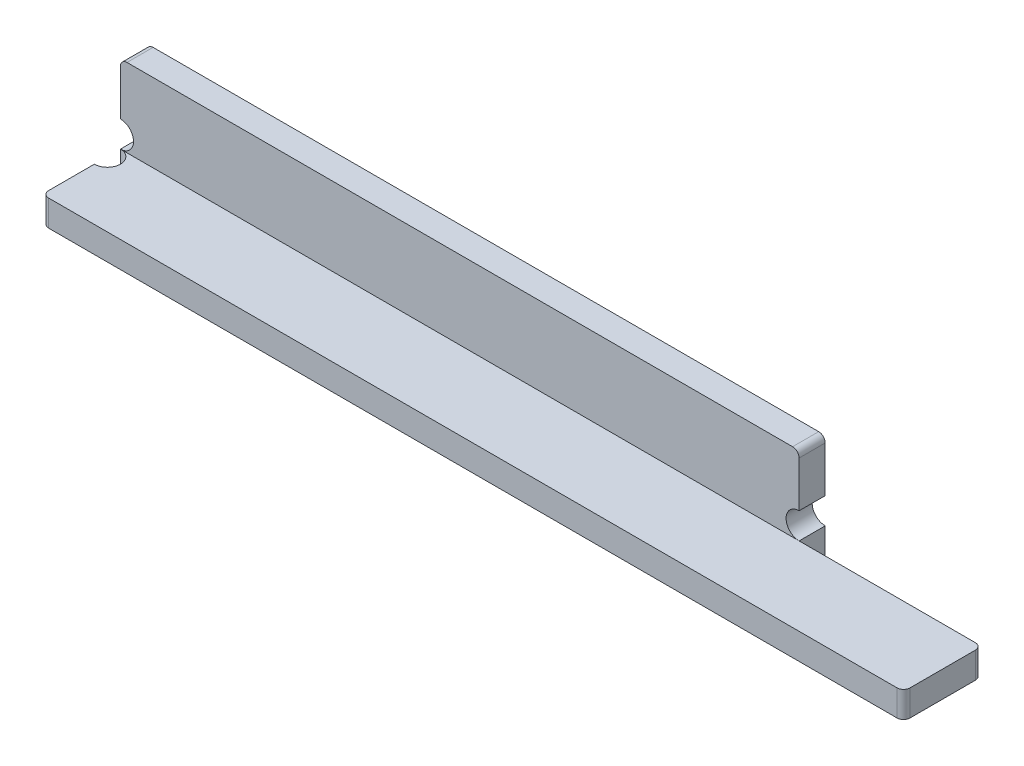
ISO-10303-21;
HEADER;
FILE_DESCRIPTION(('STEP AP214'),'2;1');
FILE_NAME('part.step','',(''),(''),'','','');
FILE_SCHEMA(('AUTOMOTIVE_DESIGN { 1 0 10303 214 1 1 1 1 }'));
ENDSEC;
DATA;
#1=APPLICATION_CONTEXT('core data for automotive mechanical design processes');
#2=APPLICATION_PROTOCOL_DEFINITION('international standard','automotive_design',2000,#1);
#3=PRODUCT_CONTEXT('',#1,'mechanical');
#4=PRODUCT('Part','Part','',(#3));
#5=PRODUCT_RELATED_PRODUCT_CATEGORY('part','',(#4));
#6=PRODUCT_DEFINITION_FORMATION('','',#4);
#7=PRODUCT_DEFINITION_CONTEXT('part definition',#1,'design');
#8=PRODUCT_DEFINITION('design','',#6,#7);
#9=PRODUCT_DEFINITION_SHAPE('','',#8);
#10=(LENGTH_UNIT() NAMED_UNIT(*) SI_UNIT(.MILLI.,.METRE.));
#11=(NAMED_UNIT(*) PLANE_ANGLE_UNIT() SI_UNIT($,.RADIAN.));
#12=(NAMED_UNIT(*) SI_UNIT($,.STERADIAN.) SOLID_ANGLE_UNIT());
#13=UNCERTAINTY_MEASURE_WITH_UNIT(LENGTH_MEASURE(1.E-05),#10,'distance_accuracy_value','');
#14=(GEOMETRIC_REPRESENTATION_CONTEXT(3) GLOBAL_UNCERTAINTY_ASSIGNED_CONTEXT((#13)) GLOBAL_UNIT_ASSIGNED_CONTEXT((#10,
#11,#12)) REPRESENTATION_CONTEXT('',''));
#15=CARTESIAN_POINT('',(0.,0.,0.));
#16=DIRECTION('',(0.,0.,1.));
#17=DIRECTION('',(1.,0.,0.));
#18=AXIS2_PLACEMENT_3D('',#15,#16,#17);
#19=CARTESIAN_POINT('',(0.,5.,0.));
#20=DIRECTION('',(1.,0.,0.));
#21=DIRECTION('',(0.,0.,-1.));
#22=AXIS2_PLACEMENT_3D('',#19,#20,#21);
#23=PLANE('',#22);
#24=DIRECTION('',(0.,-1.,0.));
#25=VECTOR('',#24,1.);
#26=CARTESIAN_POINT('',(0.,20.,2.50000000000001));
#27=LINE('',#26,#25);
#28=CARTESIAN_POINT('',(0.,18.75,2.50000000000001));
#29=VERTEX_POINT('',#28);
#30=CARTESIAN_POINT('',(0.,10.,2.50000000000001));
#31=VERTEX_POINT('',#30);
#32=EDGE_CURVE('E203',#29,#31,#27,.T.);
#33=ORIENTED_EDGE('',*,*,#32,.F.);
#34=DIRECTION('',(0.,0.,1.));
#35=VECTOR('',#34,1.);
#36=CARTESIAN_POINT('',(0.,18.75,0.));
#37=LINE('',#36,#35);
#38=CARTESIAN_POINT('',(0.,18.75,-2.5));
#39=VERTEX_POINT('',#38);
#40=EDGE_CURVE('E378',#29,#39,#37,.F.);
#41=ORIENTED_EDGE('',*,*,#40,.T.);
#42=DIRECTION('',(0.,-1.,0.));
#43=VECTOR('',#42,1.);
#44=CARTESIAN_POINT('',(0.,20.,-2.5));
#45=LINE('',#44,#43);
#46=CARTESIAN_POINT('',(0.,10.,-2.50000000000003));
#47=VERTEX_POINT('',#46);
#48=EDGE_CURVE('E215',#39,#47,#45,.T.);
#49=ORIENTED_EDGE('',*,*,#48,.T.);
#50=DIRECTION('',(0.,0.,1.));
#51=VECTOR('',#50,1.);
#52=CARTESIAN_POINT('',(0.,10.,-17.5));
#53=LINE('',#52,#51);
#54=EDGE_CURVE('E221',#47,#31,#53,.T.);
#55=ORIENTED_EDGE('',*,*,#54,.T.);
#56=EDGE_LOOP('',(#33,#41,#49,#55));
#57=FACE_BOUND('',#56,.T.);
#58=ADVANCED_FACE('F39',(#57),#23,.F.);
#59=CARTESIAN_POINT('',(130.,5.,-2.5));
#60=DIRECTION('',(-1.,0.,0.));
#61=DIRECTION('',(0.,0.,1.));
#62=AXIS2_PLACEMENT_3D('',#59,#60,#61);
#63=PLANE('',#62);
#64=DIRECTION('',(0.,-1.,0.));
#65=VECTOR('',#64,1.);
#66=CARTESIAN_POINT('',(130.,5.,-2.5));
#67=LINE('',#66,#65);
#68=CARTESIAN_POINT('',(130.,5.,-2.50000000000001));
#69=VERTEX_POINT('',#68);
#70=CARTESIAN_POINT('',(130.,0.,-2.5));
#71=VERTEX_POINT('',#70);
#72=EDGE_CURVE('E328',#69,#71,#67,.T.);
#73=ORIENTED_EDGE('',*,*,#72,.F.);
#74=DIRECTION('',(0.,0.,1.));
#75=VECTOR('',#74,1.);
#76=CARTESIAN_POINT('',(130.,5.,-17.5));
#77=LINE('',#76,#75);
#78=CARTESIAN_POINT('',(130.,5.,2.50000000000001));
#79=VERTEX_POINT('',#78);
#80=EDGE_CURVE('E232',#69,#79,#77,.T.);
#81=ORIENTED_EDGE('',*,*,#80,.T.);
#82=DIRECTION('',(0.,-1.,0.));
#83=VECTOR('',#82,1.);
#84=CARTESIAN_POINT('',(130.,5.,2.5));
#85=LINE('',#84,#83);
#86=CARTESIAN_POINT('',(130.,0.,2.5));
#87=VERTEX_POINT('',#86);
#88=EDGE_CURVE('E284',#79,#87,#85,.T.);
#89=ORIENTED_EDGE('',*,*,#88,.T.);
#90=DIRECTION('',(0.,0.,-1.));
#91=VECTOR('',#90,1.);
#92=CARTESIAN_POINT('',(130.,0.,-2.5));
#93=LINE('',#92,#91);
#94=EDGE_CURVE('E312',#87,#71,#93,.T.);
#95=ORIENTED_EDGE('',*,*,#94,.T.);
#96=EDGE_LOOP('',(#73,#81,#89,#95));
#97=FACE_BOUND('',#96,.T.);
#98=ADVANCED_FACE('F416',(#97),#63,.F.);
#99=DIRECTION('',(0.,1.,0.));
#100=VECTOR('',#99,1.);
#101=CARTESIAN_POINT('',(0.,0.,2.50000000000001));
#102=LINE('',#101,#100);
#103=CARTESIAN_POINT('',(0.,0.,2.50000000000001));
#104=VERTEX_POINT('',#103);
#105=CARTESIAN_POINT('',(0.,5.,2.50000000000001));
#106=VERTEX_POINT('',#105);
#107=EDGE_CURVE('E248',#104,#106,#102,.T.);
#108=ORIENTED_EDGE('',*,*,#107,.T.);
#109=DIRECTION('',(0.,0.,1.));
#110=VECTOR('',#109,1.);
#111=CARTESIAN_POINT('',(0.,5.,-17.5));
#112=LINE('',#111,#110);
#113=CARTESIAN_POINT('',(0.,5.,-2.50000000000001));
#114=VERTEX_POINT('',#113);
#115=EDGE_CURVE('E224',#114,#106,#112,.T.);
#116=ORIENTED_EDGE('',*,*,#115,.F.);
#117=DIRECTION('',(0.,1.,0.));
#118=VECTOR('',#117,1.);
#119=CARTESIAN_POINT('',(0.,0.,-2.5));
#120=LINE('',#119,#118);
#121=CARTESIAN_POINT('',(0.,0.,-2.5));
#122=VERTEX_POINT('',#121);
#123=EDGE_CURVE('E261',#122,#114,#120,.T.);
#124=ORIENTED_EDGE('',*,*,#123,.F.);
#125=DIRECTION('',(0.,0.,1.));
#126=VECTOR('',#125,1.);
#127=CARTESIAN_POINT('',(0.,0.,0.));
#128=LINE('',#127,#126);
#129=EDGE_CURVE('E326',#122,#104,#128,.T.);
#130=ORIENTED_EDGE('',*,*,#129,.T.);
#131=EDGE_LOOP('',(#108,#116,#124,#130));
#132=FACE_BOUND('',#131,.T.);
#133=ADVANCED_FACE('F458',(#132),#23,.F.);
#134=DIRECTION('',(0.,0.,1.));
#135=VECTOR('',#134,1.);
#136=CARTESIAN_POINT('',(0.,5.,17.5));
#137=LINE('',#136,#135);
#138=CARTESIAN_POINT('',(0.,5.,-16.25));
#139=VERTEX_POINT('',#138);
#140=CARTESIAN_POINT('',(0.,5.,-7.50000000000001));
#141=VERTEX_POINT('',#140);
#142=EDGE_CURVE('E289',#139,#141,#137,.T.);
#143=ORIENTED_EDGE('',*,*,#142,.F.);
#144=DIRECTION('',(0.,-1.,0.));
#145=VECTOR('',#144,1.);
#146=CARTESIAN_POINT('',(0.,5.,-16.25));
#147=LINE('',#146,#145);
#148=CARTESIAN_POINT('',(0.,0.,-16.25));
#149=VERTEX_POINT('',#148);
#150=EDGE_CURVE('E11',#139,#149,#147,.T.);
#151=ORIENTED_EDGE('',*,*,#150,.T.);
#152=CARTESIAN_POINT('',(0.,0.,-7.50000000000001));
#153=VERTEX_POINT('',#152);
#154=EDGE_CURVE('E324',#149,#153,#128,.T.);
#155=ORIENTED_EDGE('',*,*,#154,.T.);
#156=DIRECTION('',(0.,1.,0.));
#157=VECTOR('',#156,1.);
#158=CARTESIAN_POINT('',(0.,0.,-7.50000000000001));
#159=LINE('',#158,#157);
#160=EDGE_CURVE('E257',#153,#141,#159,.T.);
#161=ORIENTED_EDGE('',*,*,#160,.T.);
#162=EDGE_LOOP('',(#143,#151,#155,#161));
#163=FACE_BOUND('',#162,.T.);
#164=ADVANCED_FACE('F469',(#163),#23,.F.);
#165=CARTESIAN_POINT('',(0.,5.,0.));
#166=DIRECTION('',(0.,-1.,0.));
#167=DIRECTION('',(0.,0.,-1.));
#168=AXIS2_PLACEMENT_3D('',#165,#166,#167);
#169=PLANE('',#168);
#170=CARTESIAN_POINT('',(0.,5.,7.50000000000001));
#171=VERTEX_POINT('',#170);
#172=CARTESIAN_POINT('',(0.,5.,16.25));
#173=VERTEX_POINT('',#172);
#174=EDGE_CURVE('E292',#171,#173,#137,.T.);
#175=ORIENTED_EDGE('',*,*,#174,.T.);
#176=CARTESIAN_POINT('',(1.25,5.,16.25));
#177=DIRECTION('',(0.,-1.,0.));
#178=DIRECTION('',(0.,0.,-1.));
#179=AXIS2_PLACEMENT_3D('',#176,#177,#178);
#180=CIRCLE('',#179,1.25);
#181=CARTESIAN_POINT('',(1.25,5.,17.5));
#182=VERTEX_POINT('',#181);
#183=EDGE_CURVE('E353',#173,#182,#180,.F.);
#184=ORIENTED_EDGE('',*,*,#183,.T.);
#185=DIRECTION('',(1.,0.,0.));
#186=VECTOR('',#185,1.);
#187=CARTESIAN_POINT('',(165.,5.,17.5));
#188=LINE('',#187,#186);
#189=CARTESIAN_POINT('',(163.75,5.,17.5));
#190=VERTEX_POINT('',#189);
#191=EDGE_CURVE('E291',#182,#190,#188,.T.);
#192=ORIENTED_EDGE('',*,*,#191,.T.);
#193=CARTESIAN_POINT('',(163.75,5.,16.25));
#194=DIRECTION('',(0.,-1.,0.));
#195=DIRECTION('',(0.,0.,-1.));
#196=AXIS2_PLACEMENT_3D('',#193,#194,#195);
#197=CIRCLE('',#196,1.25);
#198=CARTESIAN_POINT('',(165.,5.,16.25));
#199=VERTEX_POINT('',#198);
#200=EDGE_CURVE('E351',#190,#199,#197,.F.);
#201=ORIENTED_EDGE('',*,*,#200,.T.);
#202=DIRECTION('',(0.,0.,-1.));
#203=VECTOR('',#202,1.);
#204=CARTESIAN_POINT('',(165.,5.,2.5));
#205=LINE('',#204,#203);
#206=CARTESIAN_POINT('',(165.,5.,3.75));
#207=VERTEX_POINT('',#206);
#208=EDGE_CURVE('E295',#199,#207,#205,.T.);
#209=ORIENTED_EDGE('',*,*,#208,.T.);
#210=CARTESIAN_POINT('',(163.75,5.,3.75));
#211=DIRECTION('',(0.,-1.,0.));
#212=DIRECTION('',(0.,0.,-1.));
#213=AXIS2_PLACEMENT_3D('',#210,#211,#212);
#214=CIRCLE('',#213,1.25);
#215=CARTESIAN_POINT('',(163.75,5.,2.5));
#216=VERTEX_POINT('',#215);
#217=EDGE_CURVE('E349',#207,#216,#214,.F.);
#218=ORIENTED_EDGE('',*,*,#217,.T.);
#219=DIRECTION('',(-1.,0.,0.));
#220=VECTOR('',#219,1.);
#221=CARTESIAN_POINT('',(130.,5.,2.5));
#222=LINE('',#221,#220);
#223=EDGE_CURVE('E298',#216,#79,#222,.T.);
#224=ORIENTED_EDGE('',*,*,#223,.T.);
#225=DIRECTION('',(1.,0.,0.));
#226=VECTOR('',#225,1.);
#227=CARTESIAN_POINT('',(130.,5.,2.5));
#228=LINE('',#227,#226);
#229=EDGE_CURVE('E254',#106,#79,#228,.T.);
#230=ORIENTED_EDGE('',*,*,#229,.F.);
#231=CARTESIAN_POINT('',(0.,5.,5.00000000000001));
#232=DIRECTION('',(0.,1.,0.));
#233=DIRECTION('',(0.,0.,-1.));
#234=AXIS2_PLACEMENT_3D('',#231,#232,#233);
#235=CIRCLE('',#234,2.5);
#236=EDGE_CURVE('E249',#171,#106,#235,.T.);
#237=ORIENTED_EDGE('',*,*,#236,.F.);
#238=EDGE_LOOP('',(#175,#184,#192,#201,#209,#218,#224,#230,#237));
#239=FACE_BOUND('',#238,.T.);
#240=ADVANCED_FACE('F427',(#239),#169,.F.);
#241=DIRECTION('',(0.,0.,-1.));
#242=VECTOR('',#241,1.);
#243=CARTESIAN_POINT('',(85.,5.,-17.5));
#244=LINE('',#243,#242);
#245=CARTESIAN_POINT('',(85.,5.,-7.50000000000001));
#246=VERTEX_POINT('',#245);
#247=CARTESIAN_POINT('',(85.,5.,-16.25));
#248=VERTEX_POINT('',#247);
#249=EDGE_CURVE('E300',#246,#248,#244,.T.);
#250=ORIENTED_EDGE('',*,*,#249,.T.);
#251=CARTESIAN_POINT('',(83.75,5.,-16.25));
#252=DIRECTION('',(0.,-1.,0.));
#253=DIRECTION('',(0.,0.,-1.));
#254=AXIS2_PLACEMENT_3D('',#251,#252,#253);
#255=CIRCLE('',#254,1.25);
#256=CARTESIAN_POINT('',(83.75,5.,-17.5));
#257=VERTEX_POINT('',#256);
#258=EDGE_CURVE('E47',#248,#257,#255,.F.);
#259=ORIENTED_EDGE('',*,*,#258,.T.);
#260=DIRECTION('',(-1.,0.,0.));
#261=VECTOR('',#260,1.);
#262=CARTESIAN_POINT('',(0.,5.,-17.5));
#263=LINE('',#262,#261);
#264=CARTESIAN_POINT('',(1.25,5.,-17.5));
#265=VERTEX_POINT('',#264);
#266=EDGE_CURVE('E302',#257,#265,#263,.T.);
#267=ORIENTED_EDGE('',*,*,#266,.T.);
#268=CARTESIAN_POINT('',(1.25,5.,-16.25));
#269=DIRECTION('',(0.,-1.,0.));
#270=DIRECTION('',(0.,0.,-1.));
#271=AXIS2_PLACEMENT_3D('',#268,#269,#270);
#272=CIRCLE('',#271,1.25);
#273=EDGE_CURVE('E54',#265,#139,#272,.F.);
#274=ORIENTED_EDGE('',*,*,#273,.T.);
#275=ORIENTED_EDGE('',*,*,#142,.T.);
#276=CARTESIAN_POINT('',(0.,5.,-5.));
#277=DIRECTION('',(0.,1.,0.));
#278=DIRECTION('',(0.,0.,1.));
#279=AXIS2_PLACEMENT_3D('',#276,#277,#278);
#280=CIRCLE('',#279,2.5);
#281=EDGE_CURVE('E251',#114,#141,#280,.T.);
#282=ORIENTED_EDGE('',*,*,#281,.F.);
#283=DIRECTION('',(-1.,0.,0.));
#284=VECTOR('',#283,1.);
#285=CARTESIAN_POINT('',(130.,5.,-2.5));
#286=LINE('',#285,#284);
#287=CARTESIAN_POINT('',(85.,5.,-2.50000000000001));
#288=VERTEX_POINT('',#287);
#289=EDGE_CURVE('E280',#288,#114,#286,.T.);
#290=ORIENTED_EDGE('',*,*,#289,.F.);
#291=CARTESIAN_POINT('',(85.,5.,-5.00000000000002));
#292=DIRECTION('',(0.,1.,0.));
#293=DIRECTION('',(0.,0.,-1.));
#294=AXIS2_PLACEMENT_3D('',#291,#292,#293);
#295=CIRCLE('',#294,2.5);
#296=EDGE_CURVE('E264',#246,#288,#295,.T.);
#297=ORIENTED_EDGE('',*,*,#296,.F.);
#298=EDGE_LOOP('',(#250,#259,#267,#274,#275,#282,#290,#297));
#299=FACE_BOUND('',#298,.T.);
#300=ADVANCED_FACE('F388',(#299),#169,.F.);
#301=CARTESIAN_POINT('',(165.,5.,17.5));
#302=DIRECTION('',(0.,0.,-1.));
#303=DIRECTION('',(-1.,0.,0.));
#304=AXIS2_PLACEMENT_3D('',#301,#302,#303);
#305=PLANE('',#304);
#306=ORIENTED_EDGE('',*,*,#191,.F.);
#307=DIRECTION('',(0.,-1.,0.));
#308=VECTOR('',#307,1.);
#309=CARTESIAN_POINT('',(1.25,5.,17.5));
#310=LINE('',#309,#308);
#311=CARTESIAN_POINT('',(1.25,0.,17.5));
#312=VERTEX_POINT('',#311);
#313=EDGE_CURVE('E334',#182,#312,#310,.T.);
#314=ORIENTED_EDGE('',*,*,#313,.T.);
#315=DIRECTION('',(1.,0.,0.));
#316=VECTOR('',#315,1.);
#317=CARTESIAN_POINT('',(165.,0.,17.5));
#318=LINE('',#317,#316);
#319=CARTESIAN_POINT('',(163.75,0.,17.5));
#320=VERTEX_POINT('',#319);
#321=EDGE_CURVE('E288',#312,#320,#318,.T.);
#322=ORIENTED_EDGE('',*,*,#321,.T.);
#323=DIRECTION('',(0.,-1.,0.));
#324=VECTOR('',#323,1.);
#325=CARTESIAN_POINT('',(163.75,5.,17.5));
#326=LINE('',#325,#324);
#327=EDGE_CURVE('E283',#320,#190,#326,.F.);
#328=ORIENTED_EDGE('',*,*,#327,.T.);
#329=EDGE_LOOP('',(#306,#314,#322,#328));
#330=FACE_BOUND('',#329,.T.);
#331=ADVANCED_FACE('F502',(#330),#305,.F.);
#332=CARTESIAN_POINT('',(165.,5.,2.5));
#333=DIRECTION('',(-1.,0.,0.));
#334=DIRECTION('',(0.,0.,1.));
#335=AXIS2_PLACEMENT_3D('',#332,#333,#334);
#336=PLANE('',#335);
#337=ORIENTED_EDGE('',*,*,#208,.F.);
#338=DIRECTION('',(0.,-1.,0.));
#339=VECTOR('',#338,1.);
#340=CARTESIAN_POINT('',(165.,5.,16.25));
#341=LINE('',#340,#339);
#342=CARTESIAN_POINT('',(165.,0.,16.25));
#343=VERTEX_POINT('',#342);
#344=EDGE_CURVE('E357',#199,#343,#341,.T.);
#345=ORIENTED_EDGE('',*,*,#344,.T.);
#346=DIRECTION('',(0.,0.,-1.));
#347=VECTOR('',#346,1.);
#348=CARTESIAN_POINT('',(165.,0.,2.5));
#349=LINE('',#348,#347);
#350=CARTESIAN_POINT('',(165.,0.,3.75));
#351=VERTEX_POINT('',#350);
#352=EDGE_CURVE('E307',#343,#351,#349,.T.);
#353=ORIENTED_EDGE('',*,*,#352,.T.);
#354=DIRECTION('',(0.,-1.,0.));
#355=VECTOR('',#354,1.);
#356=CARTESIAN_POINT('',(165.,5.,3.75));
#357=LINE('',#356,#355);
#358=EDGE_CURVE('E355',#351,#207,#357,.F.);
#359=ORIENTED_EDGE('',*,*,#358,.T.);
#360=EDGE_LOOP('',(#337,#345,#353,#359));
#361=FACE_BOUND('',#360,.T.);
#362=ADVANCED_FACE('F509',(#361),#336,.F.);
#363=CARTESIAN_POINT('',(130.,5.,2.5));
#364=DIRECTION('',(0.,0.,1.));
#365=DIRECTION('',(1.,0.,0.));
#366=AXIS2_PLACEMENT_3D('',#363,#364,#365);
#367=PLANE('',#366);
#368=ORIENTED_EDGE('',*,*,#223,.F.);
#369=DIRECTION('',(0.,-1.,0.));
#370=VECTOR('',#369,1.);
#371=CARTESIAN_POINT('',(163.75,5.,2.5));
#372=LINE('',#371,#370);
#373=CARTESIAN_POINT('',(163.75,0.,2.5));
#374=VERTEX_POINT('',#373);
#375=EDGE_CURVE('E360',#216,#374,#372,.T.);
#376=ORIENTED_EDGE('',*,*,#375,.T.);
#377=DIRECTION('',(-1.,0.,0.));
#378=VECTOR('',#377,1.);
#379=CARTESIAN_POINT('',(130.,0.,2.5));
#380=LINE('',#379,#378);
#381=EDGE_CURVE('E310',#374,#87,#380,.T.);
#382=ORIENTED_EDGE('',*,*,#381,.T.);
#383=ORIENTED_EDGE('',*,*,#88,.F.);
#384=EDGE_LOOP('',(#368,#376,#382,#383));
#385=FACE_BOUND('',#384,.T.);
#386=ADVANCED_FACE('F420',(#385),#367,.F.);
#387=CARTESIAN_POINT('',(130.,18.75,-2.5));
#388=VERTEX_POINT('',#387);
#389=CARTESIAN_POINT('',(130.,10.,-2.50000000000001));
#390=VERTEX_POINT('',#389);
#391=EDGE_CURVE('E329',#388,#390,#67,.T.);
#392=ORIENTED_EDGE('',*,*,#391,.F.);
#393=DIRECTION('',(0.,0.,-1.));
#394=VECTOR('',#393,1.);
#395=CARTESIAN_POINT('',(130.,18.75,-2.5));
#396=LINE('',#395,#394);
#397=CARTESIAN_POINT('',(130.,18.75,2.5));
#398=VERTEX_POINT('',#397);
#399=EDGE_CURVE('E373',#388,#398,#396,.F.);
#400=ORIENTED_EDGE('',*,*,#399,.T.);
#401=DIRECTION('',(0.,-1.,0.));
#402=VECTOR('',#401,1.);
#403=CARTESIAN_POINT('',(130.,20.,2.5));
#404=LINE('',#403,#402);
#405=CARTESIAN_POINT('',(130.,10.,2.5));
#406=VERTEX_POINT('',#405);
#407=EDGE_CURVE('E216',#398,#406,#404,.T.);
#408=ORIENTED_EDGE('',*,*,#407,.T.);
#409=DIRECTION('',(0.,0.,1.));
#410=VECTOR('',#409,1.);
#411=CARTESIAN_POINT('',(130.,10.,-17.5));
#412=LINE('',#411,#410);
#413=EDGE_CURVE('E235',#390,#406,#412,.T.);
#414=ORIENTED_EDGE('',*,*,#413,.F.);
#415=EDGE_LOOP('',(#392,#400,#408,#414));
#416=FACE_BOUND('',#415,.T.);
#417=ADVANCED_FACE('F436',(#416),#63,.F.);
#418=CARTESIAN_POINT('',(85.,5.,-2.50000000000001));
#419=DIRECTION('',(0.,0.,1.));
#420=DIRECTION('',(1.,0.,0.));
#421=AXIS2_PLACEMENT_3D('',#418,#419,#420);
#422=PLANE('',#421);
#423=DIRECTION('',(-1.,0.,0.));
#424=VECTOR('',#423,1.);
#425=CARTESIAN_POINT('',(130.,20.,-2.5));
#426=LINE('',#425,#424);
#427=CARTESIAN_POINT('',(128.75,20.,-2.5));
#428=VERTEX_POINT('',#427);
#429=CARTESIAN_POINT('',(1.25,20.,-2.5));
#430=VERTEX_POINT('',#429);
#431=EDGE_CURVE('E274',#428,#430,#426,.T.);
#432=ORIENTED_EDGE('',*,*,#431,.F.);
#433=CARTESIAN_POINT('',(128.75,18.75,-2.50000000000001));
#434=DIRECTION('',(0.,0.,1.));
#435=DIRECTION('',(1.,0.,0.));
#436=AXIS2_PLACEMENT_3D('',#433,#434,#435);
#437=CIRCLE('',#436,1.25);
#438=EDGE_CURVE('E371',#428,#388,#437,.F.);
#439=ORIENTED_EDGE('',*,*,#438,.T.);
#440=ORIENTED_EDGE('',*,*,#391,.T.);
#441=CARTESIAN_POINT('',(130.,7.5,-2.50000000000001));
#442=DIRECTION('',(0.,0.,1.));
#443=DIRECTION('',(1.,0.,0.));
#444=AXIS2_PLACEMENT_3D('',#441,#442,#443);
#445=CIRCLE('',#444,2.5);
#446=EDGE_CURVE('E241',#390,#69,#445,.T.);
#447=ORIENTED_EDGE('',*,*,#446,.T.);
#448=ORIENTED_EDGE('',*,*,#72,.T.);
#449=DIRECTION('',(-1.,0.,0.));
#450=VECTOR('',#449,1.);
#451=CARTESIAN_POINT('',(85.,0.,-2.50000000000001));
#452=LINE('',#451,#450);
#453=CARTESIAN_POINT('',(85.,0.,-2.50000000000001));
#454=VERTEX_POINT('',#453);
#455=EDGE_CURVE('E315',#71,#454,#452,.T.);
#456=ORIENTED_EDGE('',*,*,#455,.T.);
#457=DIRECTION('',(0.,-1.,0.));
#458=VECTOR('',#457,1.);
#459=CARTESIAN_POINT('',(85.,5.,-2.50000000000001));
#460=LINE('',#459,#458);
#461=EDGE_CURVE('E304',#288,#454,#460,.T.);
#462=ORIENTED_EDGE('',*,*,#461,.F.);
#463=ORIENTED_EDGE('',*,*,#289,.T.);
#464=CARTESIAN_POINT('',(0.,7.5,-2.50000000000003));
#465=DIRECTION('',(0.,0.,1.));
#466=DIRECTION('',(1.,0.,0.));
#467=AXIS2_PLACEMENT_3D('',#464,#465,#466);
#468=CIRCLE('',#467,2.5);
#469=EDGE_CURVE('E229',#114,#47,#468,.T.);
#470=ORIENTED_EDGE('',*,*,#469,.T.);
#471=ORIENTED_EDGE('',*,*,#48,.F.);
#472=CARTESIAN_POINT('',(1.25,18.75,-2.50000000000003));
#473=DIRECTION('',(0.,0.,1.));
#474=DIRECTION('',(1.,0.,0.));
#475=AXIS2_PLACEMENT_3D('',#472,#473,#474);
#476=CIRCLE('',#475,1.25);
#477=EDGE_CURVE('E369',#39,#430,#476,.F.);
#478=ORIENTED_EDGE('',*,*,#477,.T.);
#479=EDGE_LOOP('',(#432,#439,#440,#447,#448,#456,#462,#463,#470,#471,#478));
#480=FACE_BOUND('',#479,.T.);
#481=ADVANCED_FACE('F410',(#480),#422,.F.);
#482=CARTESIAN_POINT('',(85.,5.,-17.5));
#483=DIRECTION('',(-1.,0.,0.));
#484=DIRECTION('',(0.,0.,1.));
#485=AXIS2_PLACEMENT_3D('',#482,#483,#484);
#486=PLANE('',#485);
#487=DIRECTION('',(0.,0.,-1.));
#488=VECTOR('',#487,1.);
#489=CARTESIAN_POINT('',(85.,0.,-17.5));
#490=LINE('',#489,#488);
#491=CARTESIAN_POINT('',(85.,0.,-7.50000000000001));
#492=VERTEX_POINT('',#491);
#493=CARTESIAN_POINT('',(85.,0.,-16.25));
#494=VERTEX_POINT('',#493);
#495=EDGE_CURVE('E318',#492,#494,#490,.T.);
#496=ORIENTED_EDGE('',*,*,#495,.T.);
#497=DIRECTION('',(0.,-1.,0.));
#498=VECTOR('',#497,1.);
#499=CARTESIAN_POINT('',(85.,5.,-16.25));
#500=LINE('',#499,#498);
#501=EDGE_CURVE('E62',#494,#248,#500,.F.);
#502=ORIENTED_EDGE('',*,*,#501,.T.);
#503=ORIENTED_EDGE('',*,*,#249,.F.);
#504=DIRECTION('',(0.,1.,0.));
#505=VECTOR('',#504,1.);
#506=CARTESIAN_POINT('',(85.,0.,-7.50000000000001));
#507=LINE('',#506,#505);
#508=EDGE_CURVE('E244',#492,#246,#507,.T.);
#509=ORIENTED_EDGE('',*,*,#508,.F.);
#510=EDGE_LOOP('',(#496,#502,#503,#509));
#511=FACE_BOUND('',#510,.T.);
#512=ADVANCED_FACE('F402',(#511),#486,.F.);
#513=CARTESIAN_POINT('',(0.,5.,-17.5));
#514=DIRECTION('',(0.,0.,1.));
#515=DIRECTION('',(1.,0.,0.));
#516=AXIS2_PLACEMENT_3D('',#513,#514,#515);
#517=PLANE('',#516);
#518=ORIENTED_EDGE('',*,*,#266,.F.);
#519=DIRECTION('',(0.,-1.,0.));
#520=VECTOR('',#519,1.);
#521=CARTESIAN_POINT('',(83.75,5.,-17.5));
#522=LINE('',#521,#520);
#523=CARTESIAN_POINT('',(83.75,0.,-17.5));
#524=VERTEX_POINT('',#523);
#525=EDGE_CURVE('E382',#257,#524,#522,.T.);
#526=ORIENTED_EDGE('',*,*,#525,.T.);
#527=DIRECTION('',(-1.,0.,0.));
#528=VECTOR('',#527,1.);
#529=CARTESIAN_POINT('',(0.,0.,-17.5));
#530=LINE('',#529,#528);
#531=CARTESIAN_POINT('',(1.25,0.,-17.5));
#532=VERTEX_POINT('',#531);
#533=EDGE_CURVE('E320',#524,#532,#530,.T.);
#534=ORIENTED_EDGE('',*,*,#533,.T.);
#535=DIRECTION('',(0.,-1.,0.));
#536=VECTOR('',#535,1.);
#537=CARTESIAN_POINT('',(1.25,5.,-17.5));
#538=LINE('',#537,#536);
#539=EDGE_CURVE('E380',#532,#265,#538,.F.);
#540=ORIENTED_EDGE('',*,*,#539,.T.);
#541=EDGE_LOOP('',(#518,#526,#534,#540));
#542=FACE_BOUND('',#541,.T.);
#543=ADVANCED_FACE('F393',(#542),#517,.F.);
#544=CARTESIAN_POINT('',(0.,0.,7.50000000000001));
#545=VERTEX_POINT('',#544);
#546=CARTESIAN_POINT('',(0.,0.,16.25));
#547=VERTEX_POINT('',#546);
#548=EDGE_CURVE('E323',#545,#547,#128,.T.);
#549=ORIENTED_EDGE('',*,*,#548,.T.);
#550=DIRECTION('',(0.,-1.,0.));
#551=VECTOR('',#550,1.);
#552=CARTESIAN_POINT('',(0.,5.,16.25));
#553=LINE('',#552,#551);
#554=EDGE_CURVE('E347',#547,#173,#553,.F.);
#555=ORIENTED_EDGE('',*,*,#554,.T.);
#556=ORIENTED_EDGE('',*,*,#174,.F.);
#557=DIRECTION('',(0.,1.,0.));
#558=VECTOR('',#557,1.);
#559=CARTESIAN_POINT('',(0.,0.,7.50000000000001));
#560=LINE('',#559,#558);
#561=EDGE_CURVE('E252',#545,#171,#560,.T.);
#562=ORIENTED_EDGE('',*,*,#561,.F.);
#563=EDGE_LOOP('',(#549,#555,#556,#562));
#564=FACE_BOUND('',#563,.T.);
#565=ADVANCED_FACE('F459',(#564),#23,.F.);
#566=CARTESIAN_POINT('',(0.,0.,0.));
#567=DIRECTION('',(0.,-1.,0.));
#568=DIRECTION('',(0.,0.,-1.));
#569=AXIS2_PLACEMENT_3D('',#566,#567,#568);
#570=PLANE('',#569);
#571=ORIENTED_EDGE('',*,*,#321,.F.);
#572=CARTESIAN_POINT('',(1.25,0.,16.25));
#573=DIRECTION('',(0.,-1.,0.));
#574=DIRECTION('',(0.,0.,-1.));
#575=AXIS2_PLACEMENT_3D('',#572,#573,#574);
#576=CIRCLE('',#575,1.25);
#577=EDGE_CURVE('E345',#312,#547,#576,.T.);
#578=ORIENTED_EDGE('',*,*,#577,.T.);
#579=ORIENTED_EDGE('',*,*,#548,.F.);
#580=CARTESIAN_POINT('',(0.,0.,5.00000000000001));
#581=DIRECTION('',(0.,1.,0.));
#582=DIRECTION('',(0.,0.,-1.));
#583=AXIS2_PLACEMENT_3D('',#580,#581,#582);
#584=CIRCLE('',#583,2.5);
#585=EDGE_CURVE('E245',#545,#104,#584,.T.);
#586=ORIENTED_EDGE('',*,*,#585,.T.);
#587=ORIENTED_EDGE('',*,*,#129,.F.);
#588=CARTESIAN_POINT('',(0.,0.,-5.));
#589=DIRECTION('',(0.,1.,0.));
#590=DIRECTION('',(0.,0.,1.));
#591=AXIS2_PLACEMENT_3D('',#588,#589,#590);
#592=CIRCLE('',#591,2.5);
#593=EDGE_CURVE('E260',#122,#153,#592,.T.);
#594=ORIENTED_EDGE('',*,*,#593,.T.);
#595=ORIENTED_EDGE('',*,*,#154,.F.);
#596=CARTESIAN_POINT('',(1.25,0.,-16.25));
#597=DIRECTION('',(0.,-1.,0.));
#598=DIRECTION('',(0.,0.,-1.));
#599=AXIS2_PLACEMENT_3D('',#596,#597,#598);
#600=CIRCLE('',#599,1.25);
#601=EDGE_CURVE('E337',#149,#532,#600,.T.);
#602=ORIENTED_EDGE('',*,*,#601,.T.);
#603=ORIENTED_EDGE('',*,*,#533,.F.);
#604=CARTESIAN_POINT('',(83.75,0.,-16.25));
#605=DIRECTION('',(0.,-1.,0.));
#606=DIRECTION('',(0.,0.,-1.));
#607=AXIS2_PLACEMENT_3D('',#604,#605,#606);
#608=CIRCLE('',#607,1.25);
#609=EDGE_CURVE('E339',#524,#494,#608,.T.);
#610=ORIENTED_EDGE('',*,*,#609,.T.);
#611=ORIENTED_EDGE('',*,*,#495,.F.);
#612=CARTESIAN_POINT('',(85.,0.,-5.00000000000002));
#613=DIRECTION('',(0.,1.,0.));
#614=DIRECTION('',(0.,0.,-1.));
#615=AXIS2_PLACEMENT_3D('',#612,#613,#614);
#616=CIRCLE('',#615,2.5);
#617=EDGE_CURVE('E270',#492,#454,#616,.T.);
#618=ORIENTED_EDGE('',*,*,#617,.T.);
#619=ORIENTED_EDGE('',*,*,#455,.F.);
#620=ORIENTED_EDGE('',*,*,#94,.F.);
#621=ORIENTED_EDGE('',*,*,#381,.F.);
#622=CARTESIAN_POINT('',(163.75,0.,3.75));
#623=DIRECTION('',(0.,-1.,0.));
#624=DIRECTION('',(0.,0.,-1.));
#625=AXIS2_PLACEMENT_3D('',#622,#623,#624);
#626=CIRCLE('',#625,1.25);
#627=EDGE_CURVE('E341',#374,#351,#626,.T.);
#628=ORIENTED_EDGE('',*,*,#627,.T.);
#629=ORIENTED_EDGE('',*,*,#352,.F.);
#630=CARTESIAN_POINT('',(163.75,0.,16.25));
#631=DIRECTION('',(0.,-1.,0.));
#632=DIRECTION('',(0.,0.,-1.));
#633=AXIS2_PLACEMENT_3D('',#630,#631,#632);
#634=CIRCLE('',#633,1.25);
#635=EDGE_CURVE('E343',#343,#320,#634,.T.);
#636=ORIENTED_EDGE('',*,*,#635,.T.);
#637=EDGE_LOOP('',(#571,#578,#579,#586,#587,#594,#595,#602,#603,#610,#611,#618,#619,#620,#621,
#628,#629,#636));
#638=FACE_BOUND('',#637,.T.);
#639=ADVANCED_FACE('F400',(#638),#570,.T.);
#640=CARTESIAN_POINT('',(130.,20.,2.5));
#641=DIRECTION('',(0.,0.,-1.));
#642=DIRECTION('',(-1.,0.,0.));
#643=AXIS2_PLACEMENT_3D('',#640,#641,#642);
#644=PLANE('',#643);
#645=ORIENTED_EDGE('',*,*,#407,.F.);
#646=CARTESIAN_POINT('',(128.75,18.75,2.5));
#647=DIRECTION('',(0.,0.,-1.));
#648=DIRECTION('',(-1.,0.,0.));
#649=AXIS2_PLACEMENT_3D('',#646,#647,#648);
#650=CIRCLE('',#649,1.25);
#651=CARTESIAN_POINT('',(128.75,20.,2.5));
#652=VERTEX_POINT('',#651);
#653=EDGE_CURVE('E376',#398,#652,#650,.F.);
#654=ORIENTED_EDGE('',*,*,#653,.T.);
#655=DIRECTION('',(1.,0.,0.));
#656=VECTOR('',#655,1.);
#657=CARTESIAN_POINT('',(130.,20.,2.5));
#658=LINE('',#657,#656);
#659=CARTESIAN_POINT('',(1.25,20.,2.50000000000001));
#660=VERTEX_POINT('',#659);
#661=EDGE_CURVE('E277',#660,#652,#658,.T.);
#662=ORIENTED_EDGE('',*,*,#661,.F.);
#663=CARTESIAN_POINT('',(1.25,18.75,2.50000000000001));
#664=DIRECTION('',(0.,0.,-1.));
#665=DIRECTION('',(-1.,0.,0.));
#666=AXIS2_PLACEMENT_3D('',#663,#664,#665);
#667=CIRCLE('',#666,1.25);
#668=EDGE_CURVE('E211',#660,#29,#667,.F.);
#669=ORIENTED_EDGE('',*,*,#668,.T.);
#670=ORIENTED_EDGE('',*,*,#32,.T.);
#671=CARTESIAN_POINT('',(0.,7.5,2.50000000000001));
#672=DIRECTION('',(0.,0.,1.));
#673=DIRECTION('',(-1.,0.,0.));
#674=AXIS2_PLACEMENT_3D('',#671,#672,#673);
#675=CIRCLE('',#674,2.5);
#676=EDGE_CURVE('E208',#106,#31,#675,.T.);
#677=ORIENTED_EDGE('',*,*,#676,.F.);
#678=ORIENTED_EDGE('',*,*,#229,.T.);
#679=CARTESIAN_POINT('',(130.,7.5,2.50000000000001));
#680=DIRECTION('',(0.,0.,1.));
#681=DIRECTION('',(1.,0.,0.));
#682=AXIS2_PLACEMENT_3D('',#679,#680,#681);
#683=CIRCLE('',#682,2.5);
#684=EDGE_CURVE('E225',#406,#79,#683,.T.);
#685=ORIENTED_EDGE('',*,*,#684,.F.);
#686=EDGE_LOOP('',(#645,#654,#662,#669,#670,#677,#678,#685));
#687=FACE_BOUND('',#686,.T.);
#688=ADVANCED_FACE('F206',(#687),#644,.F.);
#689=CARTESIAN_POINT('',(0.,20.,0.));
#690=DIRECTION('',(0.,-1.,0.));
#691=DIRECTION('',(0.,0.,-1.));
#692=AXIS2_PLACEMENT_3D('',#689,#690,#691);
#693=PLANE('',#692);
#694=ORIENTED_EDGE('',*,*,#661,.T.);
#695=DIRECTION('',(0.,0.,-1.));
#696=VECTOR('',#695,1.);
#697=CARTESIAN_POINT('',(128.75,20.,0.));
#698=LINE('',#697,#696);
#699=EDGE_CURVE('E366',#652,#428,#698,.T.);
#700=ORIENTED_EDGE('',*,*,#699,.T.);
#701=ORIENTED_EDGE('',*,*,#431,.T.);
#702=DIRECTION('',(0.,0.,1.));
#703=VECTOR('',#702,1.);
#704=CARTESIAN_POINT('',(1.25,20.,0.));
#705=LINE('',#704,#703);
#706=EDGE_CURVE('E363',#430,#660,#705,.T.);
#707=ORIENTED_EDGE('',*,*,#706,.T.);
#708=EDGE_LOOP('',(#694,#700,#701,#707));
#709=FACE_BOUND('',#708,.T.);
#710=ADVANCED_FACE('F443',(#709),#693,.F.);
#711=CARTESIAN_POINT('',(85.,0.,-5.00000000000002));
#712=DIRECTION('',(0.,1.,0.));
#713=DIRECTION('',(0.,0.,1.));
#714=AXIS2_PLACEMENT_3D('',#711,#712,#713);
#715=CYLINDRICAL_SURFACE('',#714,2.5);
#716=ORIENTED_EDGE('',*,*,#296,.T.);
#717=ORIENTED_EDGE('',*,*,#461,.T.);
#718=ORIENTED_EDGE('',*,*,#617,.F.);
#719=ORIENTED_EDGE('',*,*,#508,.T.);
#720=EDGE_LOOP('',(#716,#717,#718,#719));
#721=FACE_BOUND('',#720,.T.);
#722=ADVANCED_FACE('F404',(#721),#715,.F.);
#723=CARTESIAN_POINT('',(0.,0.,-5.));
#724=DIRECTION('',(0.,1.,0.));
#725=DIRECTION('',(0.,0.,1.));
#726=AXIS2_PLACEMENT_3D('',#723,#724,#725);
#727=CYLINDRICAL_SURFACE('',#726,2.5);
#728=ORIENTED_EDGE('',*,*,#281,.T.);
#729=ORIENTED_EDGE('',*,*,#160,.F.);
#730=ORIENTED_EDGE('',*,*,#593,.F.);
#731=ORIENTED_EDGE('',*,*,#123,.T.);
#732=EDGE_LOOP('',(#728,#729,#730,#731));
#733=FACE_BOUND('',#732,.T.);
#734=ADVANCED_FACE('F489',(#733),#727,.F.);
#735=CARTESIAN_POINT('',(0.,0.,5.00000000000001));
#736=DIRECTION('',(0.,1.,0.));
#737=DIRECTION('',(0.,0.,1.));
#738=AXIS2_PLACEMENT_3D('',#735,#736,#737);
#739=CYLINDRICAL_SURFACE('',#738,2.5);
#740=ORIENTED_EDGE('',*,*,#236,.T.);
#741=ORIENTED_EDGE('',*,*,#107,.F.);
#742=ORIENTED_EDGE('',*,*,#585,.F.);
#743=ORIENTED_EDGE('',*,*,#561,.T.);
#744=EDGE_LOOP('',(#740,#741,#742,#743));
#745=FACE_BOUND('',#744,.T.);
#746=ADVANCED_FACE('F649',(#745),#739,.F.);
#747=CARTESIAN_POINT('',(130.,7.5,-17.5));
#748=DIRECTION('',(0.,0.,1.));
#749=DIRECTION('',(1.,0.,0.));
#750=AXIS2_PLACEMENT_3D('',#747,#748,#749);
#751=CYLINDRICAL_SURFACE('',#750,2.5);
#752=ORIENTED_EDGE('',*,*,#413,.T.);
#753=ORIENTED_EDGE('',*,*,#684,.T.);
#754=ORIENTED_EDGE('',*,*,#80,.F.);
#755=ORIENTED_EDGE('',*,*,#446,.F.);
#756=EDGE_LOOP('',(#752,#753,#754,#755));
#757=FACE_BOUND('',#756,.T.);
#758=ADVANCED_FACE('F431',(#757),#751,.F.);
#759=CARTESIAN_POINT('',(0.,7.5,-17.5));
#760=DIRECTION('',(0.,0.,1.));
#761=DIRECTION('',(1.,0.,0.));
#762=AXIS2_PLACEMENT_3D('',#759,#760,#761);
#763=CYLINDRICAL_SURFACE('',#762,2.5);
#764=ORIENTED_EDGE('',*,*,#115,.T.);
#765=ORIENTED_EDGE('',*,*,#676,.T.);
#766=ORIENTED_EDGE('',*,*,#54,.F.);
#767=ORIENTED_EDGE('',*,*,#469,.F.);
#768=EDGE_LOOP('',(#764,#765,#766,#767));
#769=FACE_BOUND('',#768,.T.);
#770=ADVANCED_FACE('F220',(#769),#763,.F.);
#771=CARTESIAN_POINT('',(1.25,5.,16.25));
#772=DIRECTION('',(0.,-1.,0.));
#773=DIRECTION('',(0.,0.,-1.));
#774=AXIS2_PLACEMENT_3D('',#771,#772,#773);
#775=CYLINDRICAL_SURFACE('',#774,1.25);
#776=ORIENTED_EDGE('',*,*,#183,.F.);
#777=ORIENTED_EDGE('',*,*,#554,.F.);
#778=ORIENTED_EDGE('',*,*,#577,.F.);
#779=ORIENTED_EDGE('',*,*,#313,.F.);
#780=EDGE_LOOP('',(#776,#777,#778,#779));
#781=FACE_BOUND('',#780,.T.);
#782=ADVANCED_FACE('F497',(#781),#775,.T.);
#783=CARTESIAN_POINT('',(163.75,5.,16.25));
#784=DIRECTION('',(0.,-1.,0.));
#785=DIRECTION('',(0.,0.,-1.));
#786=AXIS2_PLACEMENT_3D('',#783,#784,#785);
#787=CYLINDRICAL_SURFACE('',#786,1.25);
#788=ORIENTED_EDGE('',*,*,#200,.F.);
#789=ORIENTED_EDGE('',*,*,#327,.F.);
#790=ORIENTED_EDGE('',*,*,#635,.F.);
#791=ORIENTED_EDGE('',*,*,#344,.F.);
#792=EDGE_LOOP('',(#788,#789,#790,#791));
#793=FACE_BOUND('',#792,.T.);
#794=ADVANCED_FACE('F505',(#793),#787,.T.);
#795=CARTESIAN_POINT('',(163.75,5.,3.75));
#796=DIRECTION('',(0.,-1.,0.));
#797=DIRECTION('',(0.,0.,-1.));
#798=AXIS2_PLACEMENT_3D('',#795,#796,#797);
#799=CYLINDRICAL_SURFACE('',#798,1.25);
#800=ORIENTED_EDGE('',*,*,#217,.F.);
#801=ORIENTED_EDGE('',*,*,#358,.F.);
#802=ORIENTED_EDGE('',*,*,#627,.F.);
#803=ORIENTED_EDGE('',*,*,#375,.F.);
#804=EDGE_LOOP('',(#800,#801,#802,#803));
#805=FACE_BOUND('',#804,.T.);
#806=ADVANCED_FACE('F454',(#805),#799,.T.);
#807=CARTESIAN_POINT('',(128.75,18.75,0.));
#808=DIRECTION('',(0.,0.,-1.));
#809=DIRECTION('',(-1.,0.,0.));
#810=AXIS2_PLACEMENT_3D('',#807,#808,#809);
#811=CYLINDRICAL_SURFACE('',#810,1.25);
#812=ORIENTED_EDGE('',*,*,#653,.F.);
#813=ORIENTED_EDGE('',*,*,#399,.F.);
#814=ORIENTED_EDGE('',*,*,#438,.F.);
#815=ORIENTED_EDGE('',*,*,#699,.F.);
#816=EDGE_LOOP('',(#812,#813,#814,#815));
#817=FACE_BOUND('',#816,.T.);
#818=ADVANCED_FACE('F441',(#817),#811,.T.);
#819=CARTESIAN_POINT('',(1.25,18.75,0.));
#820=DIRECTION('',(0.,0.,1.));
#821=DIRECTION('',(1.,0.,0.));
#822=AXIS2_PLACEMENT_3D('',#819,#820,#821);
#823=CYLINDRICAL_SURFACE('',#822,1.25);
#824=ORIENTED_EDGE('',*,*,#477,.F.);
#825=ORIENTED_EDGE('',*,*,#40,.F.);
#826=ORIENTED_EDGE('',*,*,#668,.F.);
#827=ORIENTED_EDGE('',*,*,#706,.F.);
#828=EDGE_LOOP('',(#824,#825,#826,#827));
#829=FACE_BOUND('',#828,.T.);
#830=ADVANCED_FACE('F447',(#829),#823,.T.);
#831=CARTESIAN_POINT('',(83.75,5.,-16.25));
#832=DIRECTION('',(0.,-1.,0.));
#833=DIRECTION('',(0.,0.,-1.));
#834=AXIS2_PLACEMENT_3D('',#831,#832,#833);
#835=CYLINDRICAL_SURFACE('',#834,1.25);
#836=ORIENTED_EDGE('',*,*,#258,.F.);
#837=ORIENTED_EDGE('',*,*,#501,.F.);
#838=ORIENTED_EDGE('',*,*,#609,.F.);
#839=ORIENTED_EDGE('',*,*,#525,.F.);
#840=EDGE_LOOP('',(#836,#837,#838,#839));
#841=FACE_BOUND('',#840,.T.);
#842=ADVANCED_FACE('F396',(#841),#835,.T.);
#843=CARTESIAN_POINT('',(1.25,5.,-16.25));
#844=DIRECTION('',(0.,-1.,0.));
#845=DIRECTION('',(0.,0.,-1.));
#846=AXIS2_PLACEMENT_3D('',#843,#844,#845);
#847=CYLINDRICAL_SURFACE('',#846,1.25);
#848=ORIENTED_EDGE('',*,*,#273,.F.);
#849=ORIENTED_EDGE('',*,*,#539,.F.);
#850=ORIENTED_EDGE('',*,*,#601,.F.);
#851=ORIENTED_EDGE('',*,*,#150,.F.);
#852=EDGE_LOOP('',(#848,#849,#850,#851));
#853=FACE_BOUND('',#852,.T.);
#854=ADVANCED_FACE('F41',(#853),#847,.T.);
#855=CLOSED_SHELL('',(#58,#98,#133,#164,#240,#300,#331,#362,#386,#417,#481,#512,#543,#565,#639,
#688,#710,#722,#734,#746,#758,#770,#782,#794,#806,#818,#830,#842,#854));
#856=MANIFOLD_SOLID_BREP('B2',#855);
#857=ADVANCED_BREP_SHAPE_REPRESENTATION('',(#18,#856),#14);
#858=SHAPE_DEFINITION_REPRESENTATION(#9,#857);
ENDSEC;
END-ISO-10303-21;
